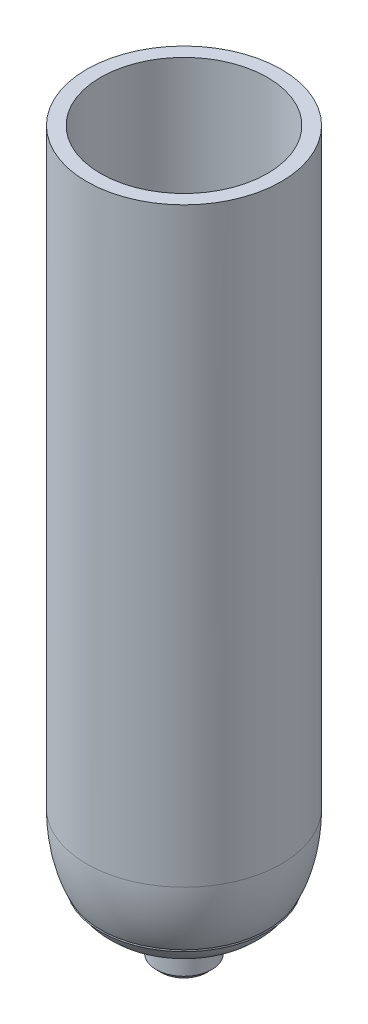
ISO-10303-21;
HEADER;
FILE_DESCRIPTION(('STEP AP214'),'2;1');
FILE_NAME('part.step','',(''),(''),'','','');
FILE_SCHEMA(('AUTOMOTIVE_DESIGN { 1 0 10303 214 1 1 1 1 }'));
ENDSEC;
DATA;
#1=APPLICATION_CONTEXT('core data for automotive mechanical design processes');
#2=APPLICATION_PROTOCOL_DEFINITION('international standard','automotive_design',2000,#1);
#3=PRODUCT_CONTEXT('',#1,'mechanical');
#4=PRODUCT('Part','Part','',(#3));
#5=PRODUCT_RELATED_PRODUCT_CATEGORY('part','',(#4));
#6=PRODUCT_DEFINITION_FORMATION('','',#4);
#7=PRODUCT_DEFINITION_CONTEXT('part definition',#1,'design');
#8=PRODUCT_DEFINITION('design','',#6,#7);
#9=PRODUCT_DEFINITION_SHAPE('','',#8);
#10=(LENGTH_UNIT() NAMED_UNIT(*) SI_UNIT(.MILLI.,.METRE.));
#11=(NAMED_UNIT(*) PLANE_ANGLE_UNIT() SI_UNIT($,.RADIAN.));
#12=(NAMED_UNIT(*) SI_UNIT($,.STERADIAN.) SOLID_ANGLE_UNIT());
#13=UNCERTAINTY_MEASURE_WITH_UNIT(LENGTH_MEASURE(1.E-05),#10,'distance_accuracy_value','');
#14=(GEOMETRIC_REPRESENTATION_CONTEXT(3) GLOBAL_UNCERTAINTY_ASSIGNED_CONTEXT((#13)) GLOBAL_UNIT_ASSIGNED_CONTEXT((#10,
#11,#12)) REPRESENTATION_CONTEXT('',''));
#15=CARTESIAN_POINT('',(0.,0.,0.));
#16=DIRECTION('',(0.,0.,1.));
#17=DIRECTION('',(1.,0.,0.));
#18=AXIS2_PLACEMENT_3D('',#15,#16,#17);
#19=CARTESIAN_POINT('',(0.,150.,0.));
#20=DIRECTION('',(0.,1.,0.));
#21=DIRECTION('',(0.,0.,1.));
#22=AXIS2_PLACEMENT_3D('',#19,#20,#21);
#23=PLANE('',#22);
#24=CARTESIAN_POINT('',(0.,150.,0.));
#25=DIRECTION('',(0.,1.,0.));
#26=DIRECTION('',(0.,0.,1.));
#27=AXIS2_PLACEMENT_3D('',#24,#25,#26);
#28=CIRCLE('',#27,22.225);
#29=CARTESIAN_POINT('',(0.,150.,22.225));
#30=VERTEX_POINT('',#29);
#31=EDGE_CURVE('E67',#30,#30,#28,.T.);
#32=ORIENTED_EDGE('',*,*,#31,.T.);
#33=EDGE_LOOP('',(#32));
#34=FACE_BOUND('',#33,.T.);
#35=CARTESIAN_POINT('',(0.,150.,0.));
#36=DIRECTION('',(0.,1.,0.));
#37=DIRECTION('',(0.,0.,1.));
#38=AXIS2_PLACEMENT_3D('',#35,#36,#37);
#39=CIRCLE('',#38,19.05);
#40=CARTESIAN_POINT('',(0.,150.,19.05));
#41=VERTEX_POINT('',#40);
#42=EDGE_CURVE('E72',#41,#41,#39,.T.);
#43=ORIENTED_EDGE('',*,*,#42,.F.);
#44=EDGE_LOOP('',(#43));
#45=FACE_BOUND('',#44,.T.);
#46=ADVANCED_FACE('F44',(#34,#45),#23,.T.);
#47=CARTESIAN_POINT('',(0.,150.,0.));
#48=DIRECTION('',(0.,-1.,0.));
#49=DIRECTION('',(0.,0.,-1.));
#50=AXIS2_PLACEMENT_3D('',#47,#48,#49);
#51=CYLINDRICAL_SURFACE('',#50,22.225);
#52=CARTESIAN_POINT('',(0.,15.,-22.225));
#53=CARTESIAN_POINT('',(2.90924569367855,15.,-22.225));
#54=CARTESIAN_POINT('',(5.81734673288316,15.,-21.6465427377114));
#55=CARTESIAN_POINT('',(11.1929318357451,15.,-19.4199024824153));
#56=CARTESIAN_POINT('',(13.6583008537364,15.,-17.7725955700056));
#57=CARTESIAN_POINT('',(17.7725955700056,15.,-13.6583008537364));
#58=CARTESIAN_POINT('',(19.4199024824146,15.,-11.1929318357466));
#59=CARTESIAN_POINT('',(21.6465427377121,15.,-5.81734673288162));
#60=CARTESIAN_POINT('',(22.225,15.,-2.90924569367367));
#61=CARTESIAN_POINT('',(22.225,15.,2.90924569367367));
#62=CARTESIAN_POINT('',(21.6465427377115,15.,5.81734673288303));
#63=CARTESIAN_POINT('',(19.4199024824152,15.,11.1929318357452));
#64=CARTESIAN_POINT('',(17.772595570007,15.,13.6583008537351));
#65=CARTESIAN_POINT('',(13.658300853735,15.,17.772595570007));
#66=CARTESIAN_POINT('',(11.1929318357466,15.,19.4199024824146));
#67=CARTESIAN_POINT('',(5.81734673288166,15.,21.6465427377121));
#68=CARTESIAN_POINT('',(2.90924569367367,15.,22.225));
#69=CARTESIAN_POINT('',(-2.90924569367367,15.,22.225));
#70=CARTESIAN_POINT('',(-5.8173467328816,15.,21.6465427377121));
#71=CARTESIAN_POINT('',(-11.1929318357466,15.,19.4199024824146));
#72=CARTESIAN_POINT('',(-13.6583008537378,15.,17.7725955700042));
#73=CARTESIAN_POINT('',(-17.7725955700042,15.,13.6583008537378));
#74=CARTESIAN_POINT('',(-19.4199024824151,15.,11.1929318357455));
#75=CARTESIAN_POINT('',(-21.6465427377116,15.,5.81734673288285));
#76=CARTESIAN_POINT('',(-22.225,15.,2.90924569367364));
#77=CARTESIAN_POINT('',(-22.225,15.,-2.90924569367371));
#78=CARTESIAN_POINT('',(-21.6465427377116,15.,-5.81734673288278));
#79=CARTESIAN_POINT('',(-19.4199024824151,15.,-11.1929318357454));
#80=CARTESIAN_POINT('',(-17.7725955700043,15.,-13.6583008537378));
#81=CARTESIAN_POINT('',(-13.6583008537379,15.,-17.7725955700042));
#82=CARTESIAN_POINT('',(-11.1929318357466,15.,-19.4199024824146));
#83=CARTESIAN_POINT('',(-5.81734673288166,15.,-21.6465427377121));
#84=CARTESIAN_POINT('',(-2.90924569367855,15.,-22.225));
#85=CARTESIAN_POINT('',(0.,15.,-22.225));
#86=(BOUNDED_CURVE() B_SPLINE_CURVE(3,(#52,#53,#54,#55,#56,#57,#58,#59,#60,#61,#62,#63,#64,#65,
#66,#67,#68,#69,#70,#71,#72,#73,#74,#75,#76,#77,#78,#79,#80,#81,#82,#83,#84,#85),.UNSPECIFIED.,
.T.,.F.) B_SPLINE_CURVE_WITH_KNOTS((4,2,2,2,2,2,2,2,2,2,2,2,2,2,2,2,4),(0.,0.392699081698724,
0.785398163397448,1.17809724509617,1.5707963267949,1.96349540849362,2.35619449019234,
2.74889357189107,3.14159265358979,3.53429173528852,3.92699081698724,4.31968989868597,
4.71238898038469,5.10508806208341,5.49778714378214,5.89048622548086,6.28318530717959),
.UNSPECIFIED.) CURVE() GEOMETRIC_REPRESENTATION_ITEM() RATIONAL_B_SPLINE_CURVE((1.,1.,1.,1.,1.,
1.,1.,1.,1.,1.,1.,1.,1.,1.,1.,1.,1.,1.,1.,1.,1.,1.,1.,1.,1.,1.,1.,1.,1.,1.,1.,1.,1.,1.)) REPRESENTATION_ITEM(''));
#87=CARTESIAN_POINT('',(0.,15.,-22.225));
#88=VERTEX_POINT('',#87);
#89=EDGE_CURVE('E11',#88,#88,#86,.F.);
#90=ORIENTED_EDGE('',*,*,#89,.T.);
#91=EDGE_LOOP('',(#90));
#92=FACE_BOUND('',#91,.T.);
#93=ORIENTED_EDGE('',*,*,#31,.F.);
#94=EDGE_LOOP('',(#93));
#95=FACE_BOUND('',#94,.T.);
#96=ADVANCED_FACE('F106',(#92,#95),#51,.T.);
#97=CARTESIAN_POINT('',(0.,150.,0.));
#98=DIRECTION('',(0.,-1.,0.));
#99=DIRECTION('',(0.,0.,-1.));
#100=AXIS2_PLACEMENT_3D('',#97,#98,#99);
#101=CYLINDRICAL_SURFACE('',#100,19.05);
#102=ORIENTED_EDGE('',*,*,#42,.T.);
#103=EDGE_LOOP('',(#102));
#104=FACE_BOUND('',#103,.T.);
#105=CARTESIAN_POINT('',(0.,0.,0.));
#106=DIRECTION('',(0.,1.,0.));
#107=DIRECTION('',(0.,0.,1.));
#108=AXIS2_PLACEMENT_3D('',#105,#106,#107);
#109=CIRCLE('',#108,19.05);
#110=CARTESIAN_POINT('',(0.,0.,19.05));
#111=VERTEX_POINT('',#110);
#112=EDGE_CURVE('E80',#111,#111,#109,.T.);
#113=ORIENTED_EDGE('',*,*,#112,.F.);
#114=EDGE_LOOP('',(#113));
#115=FACE_BOUND('',#114,.T.);
#116=ADVANCED_FACE('F102',(#104,#115),#101,.F.);
#117=CARTESIAN_POINT('',(0.,0.,0.));
#118=DIRECTION('',(0.,-1.,0.));
#119=DIRECTION('',(0.,0.,-1.));
#120=AXIS2_PLACEMENT_3D('',#117,#118,#119);
#121=PLANE('',#120);
#122=CARTESIAN_POINT('',(0.,0.,0.));
#123=DIRECTION('',(0.,-1.,0.));
#124=DIRECTION('',(0.,0.,-1.));
#125=AXIS2_PLACEMENT_3D('',#122,#123,#124);
#126=CIRCLE('',#125,4.);
#127=CARTESIAN_POINT('',(0.,0.,-4.));
#128=VERTEX_POINT('',#127);
#129=EDGE_CURVE('E159',#128,#128,#126,.F.);
#130=ORIENTED_EDGE('',*,*,#129,.F.);
#131=EDGE_LOOP('',(#130));
#132=FACE_BOUND('',#131,.T.);
#133=ORIENTED_EDGE('',*,*,#112,.T.);
#134=EDGE_LOOP('',(#133));
#135=FACE_BOUND('',#134,.T.);
#136=ADVANCED_FACE('F98',(#132,#135),#121,.F.);
#137=CARTESIAN_POINT('',(0.,-5.,0.));
#138=DIRECTION('',(0.,-1.,0.));
#139=DIRECTION('',(0.,0.,-1.));
#140=AXIS2_PLACEMENT_3D('',#137,#138,#139);
#141=PLANE('',#140);
#142=CARTESIAN_POINT('',(0.,-5.00000000000002,-12.225));
#143=CARTESIAN_POINT('',(-1.60024875614039,-5.00000000000002,-12.225));
#144=CARTESIAN_POINT('',(-3.19986788794083,-5.00000000000002,-11.9068159715878));
#145=CARTESIAN_POINT('',(-6.15674203338566,-5.00000000000002,-10.6820385983132));
#146=CARTESIAN_POINT('',(-7.51283365295587,-5.00000000000001,-9.77592714705522));
#147=CARTESIAN_POINT('',(-9.77592714705527,-5.00000000000001,-7.51283365295582));
#148=CARTESIAN_POINT('',(-10.6820385983132,-5.00000000000002,-6.15674203338562));
#149=CARTESIAN_POINT('',(-11.9068159715878,-5.00000000000002,-3.19986788794079));
#150=CARTESIAN_POINT('',(-12.225,-5.00000000000002,-1.60024875613773));
#151=CARTESIAN_POINT('',(-12.225,-5.00000000000002,1.60024875613769));
#152=CARTESIAN_POINT('',(-11.9068159715878,-5.00000000000002,3.19986788794152));
#153=CARTESIAN_POINT('',(-10.6820385983132,-5.00000000000002,6.15674203338496));
#154=CARTESIAN_POINT('',(-9.77592714705526,-5.00000000000002,7.51283365295584));
#155=CARTESIAN_POINT('',(-7.51283365295585,-5.00000000000002,9.77592714705525));
#156=CARTESIAN_POINT('',(-6.15674203338562,-5.00000000000002,10.6820385983132));
#157=CARTESIAN_POINT('',(-3.19986788794079,-5.00000000000002,11.9068159715878));
#158=CARTESIAN_POINT('',(-1.60024875613771,-5.00000000000002,12.225));
#159=CARTESIAN_POINT('',(1.60024875613771,-5.00000000000002,12.225));
#160=CARTESIAN_POINT('',(3.19986788794083,-5.00000000000002,11.9068159715878));
#161=CARTESIAN_POINT('',(6.15674203338566,-5.00000000000002,10.6820385983132));
#162=CARTESIAN_POINT('',(7.51283365295445,-5.00000000000002,9.77592714705665));
#163=CARTESIAN_POINT('',(9.77592714705663,-5.00000000000002,7.51283365295446));
#164=CARTESIAN_POINT('',(10.6820385983132,-5.00000000000002,6.15674203338495));
#165=CARTESIAN_POINT('',(11.9068159715878,-5.00000000000002,3.19986788794151));
#166=CARTESIAN_POINT('',(12.225,-5.00000000000002,1.60024875613771));
#167=CARTESIAN_POINT('',(12.225,-5.00000000000002,-1.60024875613771));
#168=CARTESIAN_POINT('',(11.9068159715878,-5.00000000000001,-3.19986788794081));
#169=CARTESIAN_POINT('',(10.6820385983132,-5.00000000000001,-6.15674203338563));
#170=CARTESIAN_POINT('',(9.77592714705664,-5.00000000000002,-7.51283365295446));
#171=CARTESIAN_POINT('',(7.51283365295446,-5.00000000000002,-9.77592714705664));
#172=CARTESIAN_POINT('',(6.15674203338525,-5.00000000000002,-10.6820385983128));
#173=CARTESIAN_POINT('',(3.1998678879412,-5.00000000000002,-11.9068159715882));
#174=CARTESIAN_POINT('',(1.60024875614039,-5.00000000000002,-12.225));
#175=CARTESIAN_POINT('',(0.,-5.00000000000002,-12.225));
#176=(BOUNDED_CURVE() B_SPLINE_CURVE(3,(#142,#143,#144,#145,#146,#147,#148,#149,#150,#151,#152,
#153,#154,#155,#156,#157,#158,#159,#160,#161,#162,#163,#164,#165,#166,#167,#168,#169,#170,#171,
#172,#173,#174,#175),.UNSPECIFIED.,.T.,.F.) B_SPLINE_CURVE_WITH_KNOTS((4,2,2,2,2,2,2,2,2,2,2,2,
2,2,2,2,4),(0.,0.392699081698725,0.785398163397448,1.17809724509617,1.5707963267949,
1.96349540849362,2.35619449019234,2.74889357189107,3.14159265358979,3.53429173528852,
3.92699081698724,4.31968989868597,4.71238898038469,5.10508806208341,5.49778714378214,
5.89048622548086,6.28318530717959),
.UNSPECIFIED.) CURVE() GEOMETRIC_REPRESENTATION_ITEM() RATIONAL_B_SPLINE_CURVE((1.,1.,1.,1.,1.,
1.,1.,1.,1.,1.,1.,1.,1.,1.,1.,1.,1.,1.,1.,1.,1.,1.,1.,1.,1.,1.,1.,1.,1.,1.,1.,1.,1.,1.)) REPRESENTATION_ITEM(''));
#177=CARTESIAN_POINT('',(0.,-5.00000000000002,-12.225));
#178=VERTEX_POINT('',#177);
#179=EDGE_CURVE('E57',#178,#178,#176,.F.);
#180=ORIENTED_EDGE('',*,*,#179,.T.);
#181=EDGE_LOOP('',(#180));
#182=FACE_BOUND('',#181,.T.);
#183=CARTESIAN_POINT('',(0.,-5.,0.));
#184=DIRECTION('',(0.,-1.,0.));
#185=DIRECTION('',(0.,0.,-1.));
#186=AXIS2_PLACEMENT_3D('',#183,#184,#185);
#187=CIRCLE('',#186,6.35);
#188=CARTESIAN_POINT('',(0.,-5.,-6.35));
#189=VERTEX_POINT('',#188);
#190=EDGE_CURVE('E62',#189,#189,#187,.T.);
#191=ORIENTED_EDGE('',*,*,#190,.F.);
#192=EDGE_LOOP('',(#191));
#193=FACE_BOUND('',#192,.T.);
#194=ADVANCED_FACE('F87',(#182,#193),#141,.T.);
#195=CARTESIAN_POINT('',(0.,-15.,0.));
#196=DIRECTION('',(0.,1.,0.));
#197=DIRECTION('',(0.,0.,1.));
#198=AXIS2_PLACEMENT_3D('',#195,#196,#197);
#199=CYLINDRICAL_SURFACE('',#198,6.35);
#200=CARTESIAN_POINT('',(0.,-13.83668,0.));
#201=DIRECTION('',(0.,1.,0.));
#202=DIRECTION('',(0.,0.,1.));
#203=AXIS2_PLACEMENT_3D('',#200,#201,#202);
#204=CIRCLE('',#203,6.34999999999999);
#205=CARTESIAN_POINT('',(0.,-13.83668,6.34999999999999));
#206=VERTEX_POINT('',#205);
#207=EDGE_CURVE('E76',#206,#206,#204,.T.);
#208=ORIENTED_EDGE('',*,*,#207,.T.);
#209=EDGE_LOOP('',(#208));
#210=FACE_BOUND('',#209,.T.);
#211=ORIENTED_EDGE('',*,*,#190,.T.);
#212=EDGE_LOOP('',(#211));
#213=FACE_BOUND('',#212,.T.);
#214=ADVANCED_FACE('F97',(#210,#213),#199,.T.);
#215=CARTESIAN_POINT('',(0.,-15.,0.));
#216=DIRECTION('',(0.,1.,0.));
#217=DIRECTION('',(0.,0.,1.));
#218=AXIS2_PLACEMENT_3D('',#215,#216,#217);
#219=CONICAL_SURFACE('',#218,5.18668,0.785398163397457);
#220=ORIENTED_EDGE('',*,*,#207,.F.);
#221=EDGE_LOOP('',(#220));
#222=FACE_BOUND('',#221,.T.);
#223=CARTESIAN_POINT('',(0.,-15.,0.));
#224=DIRECTION('',(0.,1.,0.));
#225=DIRECTION('',(0.,0.,1.));
#226=AXIS2_PLACEMENT_3D('',#223,#224,#225);
#227=CIRCLE('',#226,5.18668);
#228=CARTESIAN_POINT('',(0.,-15.,5.18668));
#229=VERTEX_POINT('',#228);
#230=EDGE_CURVE('E157',#229,#229,#227,.T.);
#231=ORIENTED_EDGE('',*,*,#230,.T.);
#232=EDGE_LOOP('',(#231));
#233=FACE_BOUND('',#232,.T.);
#234=ADVANCED_FACE('F141',(#222,#233),#219,.T.);
#235=CARTESIAN_POINT('',(0.,-15.,0.));
#236=DIRECTION('',(0.,-1.,0.));
#237=DIRECTION('',(0.,0.,-1.));
#238=AXIS2_PLACEMENT_3D('',#235,#236,#237);
#239=PLANE('',#238);
#240=CARTESIAN_POINT('',(0.,-15.,0.));
#241=DIRECTION('',(0.,-1.,0.));
#242=DIRECTION('',(0.,0.,-1.));
#243=AXIS2_PLACEMENT_3D('',#240,#241,#242);
#244=CIRCLE('',#243,4.);
#245=CARTESIAN_POINT('',(0.,-15.,-4.));
#246=VERTEX_POINT('',#245);
#247=EDGE_CURVE('E161',#246,#246,#244,.T.);
#248=ORIENTED_EDGE('',*,*,#247,.F.);
#249=EDGE_LOOP('',(#248));
#250=FACE_BOUND('',#249,.T.);
#251=ORIENTED_EDGE('',*,*,#230,.F.);
#252=EDGE_LOOP('',(#251));
#253=FACE_BOUND('',#252,.T.);
#254=ADVANCED_FACE('F135',(#250,#253),#239,.T.);
#255=CARTESIAN_POINT('',(0.,150.001,0.));
#256=DIRECTION('',(0.,-1.,0.));
#257=DIRECTION('',(0.,0.,-1.));
#258=AXIS2_PLACEMENT_3D('',#255,#256,#257);
#259=CYLINDRICAL_SURFACE('',#258,4.);
#260=ORIENTED_EDGE('',*,*,#247,.T.);
#261=EDGE_LOOP('',(#260));
#262=FACE_BOUND('',#261,.T.);
#263=ORIENTED_EDGE('',*,*,#129,.T.);
#264=EDGE_LOOP('',(#263));
#265=FACE_BOUND('',#264,.T.);
#266=ADVANCED_FACE('F131',(#262,#265),#259,.F.);
#267=CARTESIAN_POINT('',(0.,-5.00000000000002,-12.225));
#268=CARTESIAN_POINT('',(1.60024875614039,-5.00000000000002,-12.225));
#269=CARTESIAN_POINT('',(3.1998678879412,-5.00000000000002,-11.9068159715882));
#270=CARTESIAN_POINT('',(6.15674203338525,-5.00000000000002,-10.6820385983128));
#271=CARTESIAN_POINT('',(7.51283365295446,-5.00000000000002,-9.77592714705664));
#272=CARTESIAN_POINT('',(9.77592714705664,-5.00000000000002,-7.51283365295446));
#273=CARTESIAN_POINT('',(10.6820385983132,-5.00000000000001,-6.15674203338563));
#274=CARTESIAN_POINT('',(11.9068159715878,-5.00000000000001,-3.19986788794081));
#275=CARTESIAN_POINT('',(12.225,-5.00000000000002,-1.60024875613771));
#276=CARTESIAN_POINT('',(12.225,-5.00000000000002,1.60024875613771));
#277=CARTESIAN_POINT('',(11.9068159715878,-5.00000000000002,3.19986788794151));
#278=CARTESIAN_POINT('',(10.6820385983132,-5.00000000000002,6.15674203338495));
#279=CARTESIAN_POINT('',(9.77592714705663,-5.00000000000002,7.51283365295446));
#280=CARTESIAN_POINT('',(7.51283365295445,-5.00000000000002,9.77592714705665));
#281=CARTESIAN_POINT('',(6.15674203338566,-5.00000000000002,10.6820385983132));
#282=CARTESIAN_POINT('',(3.19986788794083,-5.00000000000002,11.9068159715878));
#283=CARTESIAN_POINT('',(1.60024875613771,-5.00000000000002,12.225));
#284=CARTESIAN_POINT('',(-1.60024875613771,-5.00000000000002,12.225));
#285=CARTESIAN_POINT('',(-3.19986788794079,-5.00000000000002,11.9068159715878));
#286=CARTESIAN_POINT('',(-6.15674203338562,-5.00000000000002,10.6820385983132));
#287=CARTESIAN_POINT('',(-7.51283365295585,-5.00000000000002,9.77592714705525));
#288=CARTESIAN_POINT('',(-9.77592714705526,-5.00000000000002,7.51283365295584));
#289=CARTESIAN_POINT('',(-10.6820385983132,-5.00000000000002,6.15674203338496));
#290=CARTESIAN_POINT('',(-11.9068159715878,-5.00000000000002,3.19986788794152));
#291=CARTESIAN_POINT('',(-12.225,-5.00000000000002,1.60024875613769));
#292=CARTESIAN_POINT('',(-12.225,-5.00000000000002,-1.60024875613773));
#293=CARTESIAN_POINT('',(-11.9068159715878,-5.00000000000002,-3.19986788794079));
#294=CARTESIAN_POINT('',(-10.6820385983132,-5.00000000000002,-6.15674203338562));
#295=CARTESIAN_POINT('',(-9.77592714705527,-5.00000000000001,-7.51283365295582));
#296=CARTESIAN_POINT('',(-7.51283365295587,-5.00000000000001,-9.77592714705522));
#297=CARTESIAN_POINT('',(-6.15674203338566,-5.00000000000002,-10.6820385983132));
#298=CARTESIAN_POINT('',(-3.19986788794083,-5.00000000000002,-11.9068159715878));
#299=CARTESIAN_POINT('',(-1.60024875614039,-5.00000000000002,-12.225));
#300=CARTESIAN_POINT('',(0.,-5.00000000000002,-12.225));
#301=CARTESIAN_POINT('',(0.,-5.00000000000002,-22.225));
#302=CARTESIAN_POINT('',(2.90924569367855,-5.00000000000002,-22.225));
#303=CARTESIAN_POINT('',(5.81734673288313,-5.00000000000002,-21.6465427377114));
#304=CARTESIAN_POINT('',(11.1929318357451,-5.00000000000002,-19.4199024824153));
#305=CARTESIAN_POINT('',(13.6583008537364,-5.00000000000002,-17.7725955700056));
#306=CARTESIAN_POINT('',(17.7725955700056,-5.00000000000002,-13.6583008537364));
#307=CARTESIAN_POINT('',(19.4199024824105,-5.00000000000279,-11.1929318357461));
#308=CARTESIAN_POINT('',(21.6465427377162,-4.99999999999724,-5.81734673288217));
#309=CARTESIAN_POINT('',(22.225,-5.00000000000002,-2.90924569367367));
#310=CARTESIAN_POINT('',(22.225,-5.00000000000002,2.90924569367367));
#311=CARTESIAN_POINT('',(21.6465427377162,-5.00000000000002,5.81734673288496));
#312=CARTESIAN_POINT('',(19.4199024824105,-5.00000000000002,11.1929318357433));
#313=CARTESIAN_POINT('',(17.7725955700056,-4.99999999999724,13.6583008537337));
#314=CARTESIAN_POINT('',(13.6583008537364,-5.00000000000279,17.7725955700084));
#315=CARTESIAN_POINT('',(11.1929318357461,-5.00000000000002,19.4199024824133));
#316=CARTESIAN_POINT('',(5.81734673288221,-5.00000000000002,21.6465427377134));
#317=CARTESIAN_POINT('',(2.90924569367367,-5.00000000000002,22.225));
#318=CARTESIAN_POINT('',(-2.90924569367367,-5.00000000000002,22.225));
#319=CARTESIAN_POINT('',(-5.81734673288215,-5.00000000000002,21.6465427377134));
#320=CARTESIAN_POINT('',(-11.192931835746,-5.00000000000002,19.4199024824133));
#321=CARTESIAN_POINT('',(-13.6583008537364,-5.00000000000002,17.7725955700028));
#322=CARTESIAN_POINT('',(-17.7725955700056,-5.00000000000002,13.6583008537392));
#323=CARTESIAN_POINT('',(-19.4199024824133,-5.00000000000002,11.1929318357447));
#324=CARTESIAN_POINT('',(-21.6465427377134,-5.00000000000002,5.8173467328836));
#325=CARTESIAN_POINT('',(-22.2249999999972,-4.99999999999724,2.90924569367364));
#326=CARTESIAN_POINT('',(-22.2250000000028,-5.00000000000279,-2.90924569367371));
#327=CARTESIAN_POINT('',(-21.6465427377134,-5.00000000000002,-5.81734673288214));
#328=CARTESIAN_POINT('',(-19.4199024824133,-5.00000000000002,-11.192931835746));
#329=CARTESIAN_POINT('',(-17.7725955700057,-5.00000000000279,-13.6583008537392));
#330=CARTESIAN_POINT('',(-13.6583008537365,-4.99999999999724,-17.7725955700028));
#331=CARTESIAN_POINT('',(-11.1929318357461,-5.00000000000002,-19.4199024824133));
#332=CARTESIAN_POINT('',(-5.81734673288221,-5.00000000000002,-21.6465427377134));
#333=CARTESIAN_POINT('',(-2.90924569367855,-5.00000000000002,-22.225));
#334=CARTESIAN_POINT('',(0.,-5.00000000000002,-22.225));
#335=CARTESIAN_POINT('',(0.,15.,-22.225));
#336=CARTESIAN_POINT('',(2.90924569367855,15.,-22.225));
#337=CARTESIAN_POINT('',(5.81734673288316,15.,-21.6465427377114));
#338=CARTESIAN_POINT('',(11.1929318357451,15.,-19.4199024824153));
#339=CARTESIAN_POINT('',(13.6583008537364,15.,-17.7725955700056));
#340=CARTESIAN_POINT('',(17.7725955700056,15.,-13.6583008537364));
#341=CARTESIAN_POINT('',(19.4199024824146,15.,-11.1929318357466));
#342=CARTESIAN_POINT('',(21.6465427377121,15.,-5.81734673288162));
#343=CARTESIAN_POINT('',(22.225,15.,-2.90924569367367));
#344=CARTESIAN_POINT('',(22.225,15.,2.90924569367367));
#345=CARTESIAN_POINT('',(21.6465427377115,15.,5.81734673288303));
#346=CARTESIAN_POINT('',(19.4199024824152,15.,11.1929318357452));
#347=CARTESIAN_POINT('',(17.772595570007,15.,13.6583008537351));
#348=CARTESIAN_POINT('',(13.658300853735,15.,17.772595570007));
#349=CARTESIAN_POINT('',(11.1929318357466,15.,19.4199024824146));
#350=CARTESIAN_POINT('',(5.81734673288166,15.,21.6465427377121));
#351=CARTESIAN_POINT('',(2.90924569367367,15.,22.225));
#352=CARTESIAN_POINT('',(-2.90924569367367,15.,22.225));
#353=CARTESIAN_POINT('',(-5.8173467328816,15.,21.6465427377121));
#354=CARTESIAN_POINT('',(-11.1929318357466,15.,19.4199024824146));
#355=CARTESIAN_POINT('',(-13.6583008537378,15.,17.7725955700042));
#356=CARTESIAN_POINT('',(-17.7725955700042,15.,13.6583008537378));
#357=CARTESIAN_POINT('',(-19.4199024824151,15.,11.1929318357455));
#358=CARTESIAN_POINT('',(-21.6465427377116,15.,5.81734673288285));
#359=CARTESIAN_POINT('',(-22.225,15.,2.90924569367364));
#360=CARTESIAN_POINT('',(-22.225,15.,-2.90924569367371));
#361=CARTESIAN_POINT('',(-21.6465427377116,15.,-5.81734673288278));
#362=CARTESIAN_POINT('',(-19.4199024824151,15.,-11.1929318357454));
#363=CARTESIAN_POINT('',(-17.7725955700043,15.,-13.6583008537378));
#364=CARTESIAN_POINT('',(-13.6583008537379,15.,-17.7725955700042));
#365=CARTESIAN_POINT('',(-11.1929318357466,15.,-19.4199024824146));
#366=CARTESIAN_POINT('',(-5.81734673288166,15.,-21.6465427377121));
#367=CARTESIAN_POINT('',(-2.90924569367855,15.,-22.225));
#368=CARTESIAN_POINT('',(0.,15.,-22.225));
#369=(BOUNDED_SURFACE() B_SPLINE_SURFACE(2,3,((#267,#268,#269,#270,#271,#272,#273,#274,#275,
#276,#277,#278,#279,#280,#281,#282,#283,#284,#285,#286,#287,#288,#289,#290,#291,#292,#293,#294,
#295,#296,#297,#298,#299,#300),(#301,#302,#303,#304,#305,#306,#307,#308,#309,#310,#311,#312,
#313,#314,#315,#316,#317,#318,#319,#320,#321,#322,#323,#324,#325,#326,#327,#328,#329,#330,#331,
#332,#333,#334),(#335,#336,#337,#338,#339,#340,#341,#342,#343,#344,#345,#346,#347,#348,#349,
#350,#351,#352,#353,#354,#355,#356,#357,#358,#359,#360,#361,#362,#363,#364,#365,#366,#367,
#368)),.UNSPECIFIED.,.F.,.T.,.F.) B_SPLINE_SURFACE_WITH_KNOTS((3,3),(4,2,2,2,2,2,2,2,2,2,2,2,2,
2,2,2,4),(0.,1.),(0.,0.392699081698724,0.785398163397448,1.17809724509617,1.5707963267949,
1.96349540849362,2.35619449019234,2.74889357189107,3.14159265358979,3.53429173528852,
3.92699081698724,4.31968989868597,4.71238898038469,5.10508806208341,5.49778714378214,
5.89048622548086,6.28318530717959),
.UNSPECIFIED.) GEOMETRIC_REPRESENTATION_ITEM() RATIONAL_B_SPLINE_SURFACE(((1.,1.,1.,1.,1.,1.,1.,
1.,1.,1.,1.,1.,1.,1.,1.,1.,1.,1.,1.,1.,1.,1.,1.,1.,1.,1.,1.,1.,1.,1.,1.,1.,1.,1.),
(0.707106781186548,0.707106781186548,0.707106781186548,0.707106781186548,0.707106781186548,
0.707106781186548,0.707106781186548,0.707106781186548,0.707106781186548,0.707106781186548,
0.707106781186548,0.707106781186548,0.707106781186548,0.707106781186548,0.707106781186548,
0.707106781186548,0.707106781186548,0.707106781186548,0.707106781186548,0.707106781186548,
0.707106781186548,0.707106781186548,0.707106781186548,0.707106781186548,0.707106781186548,
0.707106781186548,0.707106781186548,0.707106781186548,0.707106781186548,0.707106781186548,
0.707106781186548,0.707106781186548,0.707106781186548,0.707106781186548),(1.,1.,1.,1.,1.,1.,1.,
1.,1.,1.,1.,1.,1.,1.,1.,1.,1.,1.,1.,1.,1.,1.,1.,1.,1.,1.,1.,1.,1.,1.,1.,1.,1.,1.))) REPRESENTATION_ITEM('') SURFACE());
#370=ORIENTED_EDGE('',*,*,#89,.F.);
#371=EDGE_LOOP('',(#370));
#372=FACE_BOUND('',#371,.T.);
#373=ORIENTED_EDGE('',*,*,#179,.F.);
#374=EDGE_LOOP('',(#373));
#375=FACE_BOUND('',#374,.T.);
#376=ADVANCED_FACE('F47',(#372,#375),#369,.T.);
#377=CLOSED_SHELL('',(#46,#96,#116,#136,#194,#214,#234,#254,#266,#376));
#378=MANIFOLD_SOLID_BREP('B2',#377);
#379=ADVANCED_BREP_SHAPE_REPRESENTATION('',(#18,#378),#14);
#380=SHAPE_DEFINITION_REPRESENTATION(#9,#379);
ENDSEC;
END-ISO-10303-21;
